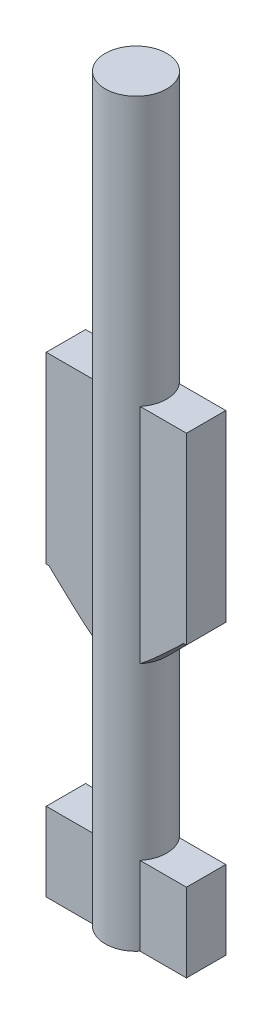
ISO-10303-21;
HEADER;
FILE_DESCRIPTION(('STEP AP214'),'2;1');
FILE_NAME('part.step','',(''),(''),'','','');
FILE_SCHEMA(('AUTOMOTIVE_DESIGN { 1 0 10303 214 1 1 1 1 }'));
ENDSEC;
DATA;
#1=APPLICATION_CONTEXT('core data for automotive mechanical design processes');
#2=APPLICATION_PROTOCOL_DEFINITION('international standard','automotive_design',2000,#1);
#3=PRODUCT_CONTEXT('',#1,'mechanical');
#4=PRODUCT('Part','Part','',(#3));
#5=PRODUCT_RELATED_PRODUCT_CATEGORY('part','',(#4));
#6=PRODUCT_DEFINITION_FORMATION('','',#4);
#7=PRODUCT_DEFINITION_CONTEXT('part definition',#1,'design');
#8=PRODUCT_DEFINITION('design','',#6,#7);
#9=PRODUCT_DEFINITION_SHAPE('','',#8);
#10=(LENGTH_UNIT() NAMED_UNIT(*) SI_UNIT(.MILLI.,.METRE.));
#11=(NAMED_UNIT(*) PLANE_ANGLE_UNIT() SI_UNIT($,.RADIAN.));
#12=(NAMED_UNIT(*) SI_UNIT($,.STERADIAN.) SOLID_ANGLE_UNIT());
#13=UNCERTAINTY_MEASURE_WITH_UNIT(LENGTH_MEASURE(1.E-05),#10,'distance_accuracy_value','');
#14=(GEOMETRIC_REPRESENTATION_CONTEXT(3) GLOBAL_UNCERTAINTY_ASSIGNED_CONTEXT((#13)) GLOBAL_UNIT_ASSIGNED_CONTEXT((#10,
#11,#12)) REPRESENTATION_CONTEXT('',''));
#15=CARTESIAN_POINT('',(0.,0.,0.));
#16=DIRECTION('',(0.,0.,1.));
#17=DIRECTION('',(1.,0.,0.));
#18=AXIS2_PLACEMENT_3D('',#15,#16,#17);
#19=CARTESIAN_POINT('',(0.,22.,0.));
#20=DIRECTION('',(0.,1.,0.));
#21=DIRECTION('',(0.,0.,1.));
#22=AXIS2_PLACEMENT_3D('',#19,#20,#21);
#23=PLANE('',#22);
#24=DIRECTION('',(-1.,0.,0.));
#25=VECTOR('',#24,1.);
#26=CARTESIAN_POINT('',(0.,22.,1.5));
#27=LINE('',#26,#25);
#28=CARTESIAN_POINT('',(5.35,22.,1.5));
#29=VERTEX_POINT('',#28);
#30=CARTESIAN_POINT('',(5.13541624408384,22.,1.5));
#31=VERTEX_POINT('',#30);
#32=EDGE_CURVE('E296',#29,#31,#27,.T.);
#33=ORIENTED_EDGE('',*,*,#32,.T.);
#34=CARTESIAN_POINT('',(0.,22.,0.));
#35=DIRECTION('',(0.,1.,0.));
#36=DIRECTION('',(0.,0.,1.));
#37=AXIS2_PLACEMENT_3D('',#34,#35,#36);
#38=CIRCLE('',#37,5.35000000000001);
#39=CARTESIAN_POINT('',(5.35,22.,0.));
#40=VERTEX_POINT('',#39);
#41=EDGE_CURVE('E326',#31,#40,#38,.T.);
#42=ORIENTED_EDGE('',*,*,#41,.T.);
#43=DIRECTION('',(0.,0.,1.));
#44=VECTOR('',#43,1.);
#45=CARTESIAN_POINT('',(5.35,22.,0.));
#46=LINE('',#45,#44);
#47=EDGE_CURVE('E295',#40,#29,#46,.T.);
#48=ORIENTED_EDGE('',*,*,#47,.T.);
#49=EDGE_LOOP('',(#33,#42,#48));
#50=FACE_BOUND('',#49,.T.);
#51=ADVANCED_FACE('F47',(#50),#23,.F.);
#52=DIRECTION('',(-1.,0.,0.));
#53=VECTOR('',#52,1.);
#54=CARTESIAN_POINT('',(0.,22.,-1.5));
#55=LINE('',#54,#53);
#56=CARTESIAN_POINT('',(-5.13541624408384,22.,-1.5));
#57=VERTEX_POINT('',#56);
#58=CARTESIAN_POINT('',(-5.35,22.,-1.5));
#59=VERTEX_POINT('',#58);
#60=EDGE_CURVE('E286',#57,#59,#55,.T.);
#61=ORIENTED_EDGE('',*,*,#60,.F.);
#62=CARTESIAN_POINT('',(0.,22.,0.));
#63=DIRECTION('',(0.,1.,0.));
#64=DIRECTION('',(0.,0.,1.));
#65=AXIS2_PLACEMENT_3D('',#62,#63,#64);
#66=CIRCLE('',#65,5.35000000000001);
#67=CARTESIAN_POINT('',(-5.35,22.,0.));
#68=VERTEX_POINT('',#67);
#69=EDGE_CURVE('E232',#57,#68,#66,.T.);
#70=ORIENTED_EDGE('',*,*,#69,.T.);
#71=DIRECTION('',(0.,0.,1.));
#72=VECTOR('',#71,1.);
#73=CARTESIAN_POINT('',(-5.35,22.,0.));
#74=LINE('',#73,#72);
#75=EDGE_CURVE('E281',#59,#68,#74,.T.);
#76=ORIENTED_EDGE('',*,*,#75,.F.);
#77=EDGE_LOOP('',(#61,#70,#76));
#78=FACE_BOUND('',#77,.T.);
#79=ADVANCED_FACE('F402',(#78),#23,.F.);
#80=CARTESIAN_POINT('',(0.,36.,0.));
#81=DIRECTION('',(0.,1.,0.));
#82=DIRECTION('',(0.,0.,1.));
#83=AXIS2_PLACEMENT_3D('',#80,#81,#82);
#84=PLANE('',#83);
#85=CARTESIAN_POINT('',(0.,36.,0.));
#86=DIRECTION('',(0.,1.,0.));
#87=DIRECTION('',(0.,0.,1.));
#88=AXIS2_PLACEMENT_3D('',#85,#86,#87);
#89=CIRCLE('',#88,2.35);
#90=CARTESIAN_POINT('',(1.80900525151256,36.,1.5));
#91=VERTEX_POINT('',#90);
#92=CARTESIAN_POINT('',(1.80900525151255,36.,-1.5));
#93=VERTEX_POINT('',#92);
#94=EDGE_CURVE('E204',#91,#93,#89,.T.);
#95=ORIENTED_EDGE('',*,*,#94,.F.);
#96=DIRECTION('',(-1.,0.,0.));
#97=VECTOR('',#96,1.);
#98=CARTESIAN_POINT('',(0.,36.,1.5));
#99=LINE('',#98,#97);
#100=CARTESIAN_POINT('',(5.35,36.,1.5));
#101=VERTEX_POINT('',#100);
#102=EDGE_CURVE('E184',#101,#91,#99,.T.);
#103=ORIENTED_EDGE('',*,*,#102,.F.);
#104=DIRECTION('',(0.,0.,1.));
#105=VECTOR('',#104,1.);
#106=CARTESIAN_POINT('',(5.35,36.,0.));
#107=LINE('',#106,#105);
#108=CARTESIAN_POINT('',(5.35,36.,-1.5));
#109=VERTEX_POINT('',#108);
#110=EDGE_CURVE('E197',#109,#101,#107,.T.);
#111=ORIENTED_EDGE('',*,*,#110,.F.);
#112=DIRECTION('',(1.,0.,0.));
#113=VECTOR('',#112,1.);
#114=CARTESIAN_POINT('',(0.,36.,-1.5));
#115=LINE('',#114,#113);
#116=EDGE_CURVE('E214',#93,#109,#115,.T.);
#117=ORIENTED_EDGE('',*,*,#116,.F.);
#118=EDGE_LOOP('',(#95,#103,#111,#117));
#119=FACE_BOUND('',#118,.T.);
#120=ADVANCED_FACE('F212',(#119),#84,.T.);
#121=CARTESIAN_POINT('',(0.,6.,0.));
#122=DIRECTION('',(0.,1.,0.));
#123=DIRECTION('',(0.,0.,1.));
#124=AXIS2_PLACEMENT_3D('',#121,#122,#123);
#125=PLANE('',#124);
#126=CARTESIAN_POINT('',(0.,6.,0.));
#127=DIRECTION('',(0.,1.,0.));
#128=DIRECTION('',(0.,0.,1.));
#129=AXIS2_PLACEMENT_3D('',#126,#127,#128);
#130=CIRCLE('',#129,2.35);
#131=CARTESIAN_POINT('',(1.80900525151256,6.,1.5));
#132=VERTEX_POINT('',#131);
#133=CARTESIAN_POINT('',(1.80900525151255,6.,-1.5));
#134=VERTEX_POINT('',#133);
#135=EDGE_CURVE('E237',#132,#134,#130,.T.);
#136=ORIENTED_EDGE('',*,*,#135,.F.);
#137=DIRECTION('',(1.,0.,0.));
#138=VECTOR('',#137,1.);
#139=CARTESIAN_POINT('',(0.,6.,1.5));
#140=LINE('',#139,#138);
#141=CARTESIAN_POINT('',(5.35,6.,1.5));
#142=VERTEX_POINT('',#141);
#143=EDGE_CURVE('E490',#132,#142,#140,.T.);
#144=ORIENTED_EDGE('',*,*,#143,.T.);
#145=DIRECTION('',(0.,0.,-1.));
#146=VECTOR('',#145,1.);
#147=CARTESIAN_POINT('',(5.35,6.,0.));
#148=LINE('',#147,#146);
#149=CARTESIAN_POINT('',(5.35,6.,-1.5));
#150=VERTEX_POINT('',#149);
#151=EDGE_CURVE('E487',#142,#150,#148,.T.);
#152=ORIENTED_EDGE('',*,*,#151,.T.);
#153=DIRECTION('',(-1.,0.,0.));
#154=VECTOR('',#153,1.);
#155=CARTESIAN_POINT('',(0.,6.,-1.5));
#156=LINE('',#155,#154);
#157=EDGE_CURVE('E484',#150,#134,#156,.T.);
#158=ORIENTED_EDGE('',*,*,#157,.T.);
#159=EDGE_LOOP('',(#136,#144,#152,#158));
#160=FACE_BOUND('',#159,.T.);
#161=ADVANCED_FACE('F366',(#160),#125,.T.);
#162=CARTESIAN_POINT('',(0.,6.,1.5));
#163=DIRECTION('',(0.,0.,1.));
#164=DIRECTION('',(1.,0.,0.));
#165=AXIS2_PLACEMENT_3D('',#162,#163,#164);
#166=PLANE('',#165);
#167=DIRECTION('',(-1.,0.,0.));
#168=VECTOR('',#167,1.);
#169=CARTESIAN_POINT('',(0.,0.,1.5));
#170=LINE('',#169,#168);
#171=CARTESIAN_POINT('',(-1.80900525151255,0.,1.5));
#172=VERTEX_POINT('',#171);
#173=CARTESIAN_POINT('',(-5.35,0.,1.5));
#174=VERTEX_POINT('',#173);
#175=EDGE_CURVE('E247',#172,#174,#170,.T.);
#176=ORIENTED_EDGE('',*,*,#175,.F.);
#177=DIRECTION('',(0.,-1.,0.));
#178=VECTOR('',#177,1.);
#179=CARTESIAN_POINT('',(-1.80900525151255,6.,1.5));
#180=LINE('',#179,#178);
#181=CARTESIAN_POINT('',(-1.80900525151255,6.,1.5));
#182=VERTEX_POINT('',#181);
#183=EDGE_CURVE('E235',#182,#172,#180,.T.);
#184=ORIENTED_EDGE('',*,*,#183,.F.);
#185=DIRECTION('',(-1.,0.,0.));
#186=VECTOR('',#185,1.);
#187=CARTESIAN_POINT('',(0.,6.,1.5));
#188=LINE('',#187,#186);
#189=CARTESIAN_POINT('',(-5.35,6.,1.5));
#190=VERTEX_POINT('',#189);
#191=EDGE_CURVE('E460',#182,#190,#188,.T.);
#192=ORIENTED_EDGE('',*,*,#191,.T.);
#193=DIRECTION('',(0.,-1.,0.));
#194=VECTOR('',#193,1.);
#195=CARTESIAN_POINT('',(-5.35,6.,1.5));
#196=LINE('',#195,#194);
#197=EDGE_CURVE('E452',#190,#174,#196,.T.);
#198=ORIENTED_EDGE('',*,*,#197,.T.);
#199=EDGE_LOOP('',(#176,#184,#192,#198));
#200=FACE_BOUND('',#199,.T.);
#201=ADVANCED_FACE('F361',(#200),#166,.T.);
#202=CARTESIAN_POINT('',(0.,6.,1.5));
#203=DIRECTION('',(0.,0.,-1.));
#204=DIRECTION('',(-1.,0.,0.));
#205=AXIS2_PLACEMENT_3D('',#202,#203,#204);
#206=PLANE('',#205);
#207=DIRECTION('',(1.,0.,0.));
#208=VECTOR('',#207,1.);
#209=CARTESIAN_POINT('',(0.,0.,1.5));
#210=LINE('',#209,#208);
#211=CARTESIAN_POINT('',(1.80900525151256,0.,1.5));
#212=VERTEX_POINT('',#211);
#213=CARTESIAN_POINT('',(5.35,0.,1.5));
#214=VERTEX_POINT('',#213);
#215=EDGE_CURVE('E472',#212,#214,#210,.T.);
#216=ORIENTED_EDGE('',*,*,#215,.T.);
#217=DIRECTION('',(0.,-1.,0.));
#218=VECTOR('',#217,1.);
#219=CARTESIAN_POINT('',(5.35,6.,1.5));
#220=LINE('',#219,#218);
#221=EDGE_CURVE('E435',#142,#214,#220,.T.);
#222=ORIENTED_EDGE('',*,*,#221,.F.);
#223=ORIENTED_EDGE('',*,*,#143,.F.);
#224=DIRECTION('',(0.,-1.,0.));
#225=VECTOR('',#224,1.);
#226=CARTESIAN_POINT('',(1.80900525151256,6.,1.5));
#227=LINE('',#226,#225);
#228=EDGE_CURVE('E241',#132,#212,#227,.T.);
#229=ORIENTED_EDGE('',*,*,#228,.T.);
#230=EDGE_LOOP('',(#216,#222,#223,#229));
#231=FACE_BOUND('',#230,.T.);
#232=ADVANCED_FACE('F365',(#231),#206,.F.);
#233=CARTESIAN_POINT('',(5.35,6.,0.));
#234=DIRECTION('',(-1.,0.,0.));
#235=DIRECTION('',(0.,0.,1.));
#236=AXIS2_PLACEMENT_3D('',#233,#234,#235);
#237=PLANE('',#236);
#238=DIRECTION('',(0.,0.,-1.));
#239=VECTOR('',#238,1.);
#240=CARTESIAN_POINT('',(5.35,0.,0.));
#241=LINE('',#240,#239);
#242=CARTESIAN_POINT('',(5.35,0.,-1.5));
#243=VERTEX_POINT('',#242);
#244=EDGE_CURVE('E469',#214,#243,#241,.T.);
#245=ORIENTED_EDGE('',*,*,#244,.T.);
#246=DIRECTION('',(0.,-1.,0.));
#247=VECTOR('',#246,1.);
#248=CARTESIAN_POINT('',(5.35,6.,-1.5));
#249=LINE('',#248,#247);
#250=EDGE_CURVE('E439',#150,#243,#249,.T.);
#251=ORIENTED_EDGE('',*,*,#250,.F.);
#252=ORIENTED_EDGE('',*,*,#151,.F.);
#253=ORIENTED_EDGE('',*,*,#221,.T.);
#254=EDGE_LOOP('',(#245,#251,#252,#253));
#255=FACE_BOUND('',#254,.T.);
#256=ADVANCED_FACE('F370',(#255),#237,.F.);
#257=CARTESIAN_POINT('',(0.,6.,-1.5));
#258=DIRECTION('',(0.,0.,1.));
#259=DIRECTION('',(1.,0.,0.));
#260=AXIS2_PLACEMENT_3D('',#257,#258,#259);
#261=PLANE('',#260);
#262=DIRECTION('',(-1.,0.,0.));
#263=VECTOR('',#262,1.);
#264=CARTESIAN_POINT('',(0.,0.,-1.5));
#265=LINE('',#264,#263);
#266=CARTESIAN_POINT('',(1.80900525151255,0.,-1.5));
#267=VERTEX_POINT('',#266);
#268=EDGE_CURVE('E466',#243,#267,#265,.T.);
#269=ORIENTED_EDGE('',*,*,#268,.T.);
#270=DIRECTION('',(0.,-1.,0.));
#271=VECTOR('',#270,1.);
#272=CARTESIAN_POINT('',(1.80900525151255,6.,-1.5));
#273=LINE('',#272,#271);
#274=EDGE_CURVE('E443',#134,#267,#273,.T.);
#275=ORIENTED_EDGE('',*,*,#274,.F.);
#276=ORIENTED_EDGE('',*,*,#157,.F.);
#277=ORIENTED_EDGE('',*,*,#250,.T.);
#278=EDGE_LOOP('',(#269,#275,#276,#277));
#279=FACE_BOUND('',#278,.T.);
#280=ADVANCED_FACE('F374',(#279),#261,.F.);
#281=CARTESIAN_POINT('',(0.,6.,0.));
#282=DIRECTION('',(0.,-1.,0.));
#283=DIRECTION('',(0.,0.,-1.));
#284=AXIS2_PLACEMENT_3D('',#281,#282,#283);
#285=CYLINDRICAL_SURFACE('',#284,2.35);
#286=DIRECTION('',(0.,-1.,0.));
#287=VECTOR('',#286,1.);
#288=CARTESIAN_POINT('',(-1.80900525151255,36.,1.5));
#289=LINE('',#288,#287);
#290=CARTESIAN_POINT('',(-1.80900525151255,36.,1.5));
#291=VERTEX_POINT('',#290);
#292=CARTESIAN_POINT('',(-1.80900525151255,19.,1.5));
#293=VERTEX_POINT('',#292);
#294=EDGE_CURVE('E209',#291,#293,#289,.T.);
#295=ORIENTED_EDGE('',*,*,#294,.T.);
#296=CARTESIAN_POINT('',(0.,19.,0.));
#297=DIRECTION('',(0.,1.,0.));
#298=DIRECTION('',(0.,0.,1.));
#299=AXIS2_PLACEMENT_3D('',#296,#297,#298);
#300=CIRCLE('',#299,2.35);
#301=CARTESIAN_POINT('',(-1.80900525151255,19.,-1.5));
#302=VERTEX_POINT('',#301);
#303=EDGE_CURVE('E329',#293,#302,#300,.F.);
#304=ORIENTED_EDGE('',*,*,#303,.T.);
#305=DIRECTION('',(0.,-1.,0.));
#306=VECTOR('',#305,1.);
#307=CARTESIAN_POINT('',(-1.80900525151255,36.,-1.5));
#308=LINE('',#307,#306);
#309=CARTESIAN_POINT('',(-1.80900525151255,36.,-1.5));
#310=VERTEX_POINT('',#309);
#311=EDGE_CURVE('E269',#310,#302,#308,.T.);
#312=ORIENTED_EDGE('',*,*,#311,.F.);
#313=EDGE_CURVE('E218',#310,#291,#89,.T.);
#314=ORIENTED_EDGE('',*,*,#313,.T.);
#315=EDGE_LOOP('',(#295,#304,#312,#314));
#316=FACE_BOUND('',#315,.T.);
#317=CARTESIAN_POINT('',(0.,0.,0.));
#318=DIRECTION('',(0.,1.,0.));
#319=DIRECTION('',(0.,0.,1.));
#320=AXIS2_PLACEMENT_3D('',#317,#318,#319);
#321=CIRCLE('',#320,2.35);
#322=CARTESIAN_POINT('',(-1.80900525151255,0.,-1.5));
#323=VERTEX_POINT('',#322);
#324=EDGE_CURVE('E465',#267,#323,#321,.T.);
#325=ORIENTED_EDGE('',*,*,#324,.T.);
#326=DIRECTION('',(0.,-1.,0.));
#327=VECTOR('',#326,1.);
#328=CARTESIAN_POINT('',(-1.80900525151255,6.,-1.5));
#329=LINE('',#328,#327);
#330=CARTESIAN_POINT('',(-1.80900525151255,6.,-1.5));
#331=VERTEX_POINT('',#330);
#332=EDGE_CURVE('E446',#331,#323,#329,.T.);
#333=ORIENTED_EDGE('',*,*,#332,.F.);
#334=EDGE_CURVE('E227',#331,#182,#130,.T.);
#335=ORIENTED_EDGE('',*,*,#334,.T.);
#336=ORIENTED_EDGE('',*,*,#183,.T.);
#337=EDGE_CURVE('E254',#172,#212,#321,.T.);
#338=ORIENTED_EDGE('',*,*,#337,.T.);
#339=ORIENTED_EDGE('',*,*,#228,.F.);
#340=ORIENTED_EDGE('',*,*,#135,.T.);
#341=ORIENTED_EDGE('',*,*,#274,.T.);
#342=EDGE_LOOP('',(#325,#333,#335,#336,#338,#339,#340,#341));
#343=FACE_BOUND('',#342,.T.);
#344=DIRECTION('',(0.,-1.,0.));
#345=VECTOR('',#344,1.);
#346=CARTESIAN_POINT('',(1.80900525151255,36.,-1.5));
#347=LINE('',#346,#345);
#348=CARTESIAN_POINT('',(1.80900525151255,19.,-1.5));
#349=VERTEX_POINT('',#348);
#350=EDGE_CURVE('E266',#93,#349,#347,.T.);
#351=ORIENTED_EDGE('',*,*,#350,.T.);
#352=CARTESIAN_POINT('',(0.,19.,0.));
#353=DIRECTION('',(0.,1.,0.));
#354=DIRECTION('',(0.,0.,1.));
#355=AXIS2_PLACEMENT_3D('',#352,#353,#354);
#356=CIRCLE('',#355,2.35);
#357=CARTESIAN_POINT('',(1.80900525151256,19.,1.5));
#358=VERTEX_POINT('',#357);
#359=EDGE_CURVE('E206',#349,#358,#356,.F.);
#360=ORIENTED_EDGE('',*,*,#359,.T.);
#361=DIRECTION('',(0.,-1.,0.));
#362=VECTOR('',#361,1.);
#363=CARTESIAN_POINT('',(1.80900525151256,36.,1.5));
#364=LINE('',#363,#362);
#365=EDGE_CURVE('E188',#91,#358,#364,.T.);
#366=ORIENTED_EDGE('',*,*,#365,.F.);
#367=ORIENTED_EDGE('',*,*,#94,.T.);
#368=EDGE_LOOP('',(#351,#360,#366,#367));
#369=FACE_BOUND('',#368,.T.);
#370=CARTESIAN_POINT('',(0.,56.5,0.));
#371=DIRECTION('',(0.,1.,0.));
#372=DIRECTION('',(0.,0.,1.));
#373=AXIS2_PLACEMENT_3D('',#370,#371,#372);
#374=CIRCLE('',#373,2.35);
#375=CARTESIAN_POINT('',(0.,56.5,2.35));
#376=VERTEX_POINT('',#375);
#377=EDGE_CURVE('E216',#376,#376,#374,.T.);
#378=ORIENTED_EDGE('',*,*,#377,.F.);
#379=EDGE_LOOP('',(#378));
#380=FACE_BOUND('',#379,.T.);
#381=ADVANCED_FACE('F202',(#316,#343,#369,#380),#285,.T.);
#382=CARTESIAN_POINT('',(0.,6.,-1.5));
#383=DIRECTION('',(0.,0.,-1.));
#384=DIRECTION('',(-1.,0.,0.));
#385=AXIS2_PLACEMENT_3D('',#382,#383,#384);
#386=PLANE('',#385);
#387=DIRECTION('',(1.,0.,0.));
#388=VECTOR('',#387,1.);
#389=CARTESIAN_POINT('',(0.,0.,-1.5));
#390=LINE('',#389,#388);
#391=CARTESIAN_POINT('',(-5.35,0.,-1.5));
#392=VERTEX_POINT('',#391);
#393=EDGE_CURVE('E461',#392,#323,#390,.T.);
#394=ORIENTED_EDGE('',*,*,#393,.F.);
#395=DIRECTION('',(0.,-1.,0.));
#396=VECTOR('',#395,1.);
#397=CARTESIAN_POINT('',(-5.35,6.,-1.5));
#398=LINE('',#397,#396);
#399=CARTESIAN_POINT('',(-5.35,6.,-1.5));
#400=VERTEX_POINT('',#399);
#401=EDGE_CURVE('E449',#400,#392,#398,.T.);
#402=ORIENTED_EDGE('',*,*,#401,.F.);
#403=DIRECTION('',(1.,0.,0.));
#404=VECTOR('',#403,1.);
#405=CARTESIAN_POINT('',(0.,6.,-1.5));
#406=LINE('',#405,#404);
#407=EDGE_CURVE('E480',#400,#331,#406,.T.);
#408=ORIENTED_EDGE('',*,*,#407,.T.);
#409=ORIENTED_EDGE('',*,*,#332,.T.);
#410=EDGE_LOOP('',(#394,#402,#408,#409));
#411=FACE_BOUND('',#410,.T.);
#412=ADVANCED_FACE('F381',(#411),#386,.T.);
#413=CARTESIAN_POINT('',(-5.35,6.,0.));
#414=DIRECTION('',(-1.,0.,0.));
#415=DIRECTION('',(0.,0.,1.));
#416=AXIS2_PLACEMENT_3D('',#413,#414,#415);
#417=PLANE('',#416);
#418=DIRECTION('',(0.,0.,-1.));
#419=VECTOR('',#418,1.);
#420=CARTESIAN_POINT('',(-5.35,0.,0.));
#421=LINE('',#420,#419);
#422=EDGE_CURVE('E456',#174,#392,#421,.T.);
#423=ORIENTED_EDGE('',*,*,#422,.F.);
#424=ORIENTED_EDGE('',*,*,#197,.F.);
#425=DIRECTION('',(0.,0.,-1.));
#426=VECTOR('',#425,1.);
#427=CARTESIAN_POINT('',(-5.35,6.,0.));
#428=LINE('',#427,#426);
#429=EDGE_CURVE('E455',#190,#400,#428,.T.);
#430=ORIENTED_EDGE('',*,*,#429,.T.);
#431=ORIENTED_EDGE('',*,*,#401,.T.);
#432=EDGE_LOOP('',(#423,#424,#430,#431));
#433=FACE_BOUND('',#432,.T.);
#434=ADVANCED_FACE('F384',(#433),#417,.T.);
#435=ORIENTED_EDGE('',*,*,#334,.F.);
#436=ORIENTED_EDGE('',*,*,#407,.F.);
#437=ORIENTED_EDGE('',*,*,#429,.F.);
#438=ORIENTED_EDGE('',*,*,#191,.F.);
#439=EDGE_LOOP('',(#435,#436,#437,#438));
#440=FACE_BOUND('',#439,.T.);
#441=ADVANCED_FACE('F388',(#440),#125,.T.);
#442=CARTESIAN_POINT('',(0.,0.,0.));
#443=DIRECTION('',(0.,1.,0.));
#444=DIRECTION('',(0.,0.,1.));
#445=AXIS2_PLACEMENT_3D('',#442,#443,#444);
#446=PLANE('',#445);
#447=ORIENTED_EDGE('',*,*,#175,.T.);
#448=ORIENTED_EDGE('',*,*,#422,.T.);
#449=ORIENTED_EDGE('',*,*,#393,.T.);
#450=ORIENTED_EDGE('',*,*,#324,.F.);
#451=ORIENTED_EDGE('',*,*,#268,.F.);
#452=ORIENTED_EDGE('',*,*,#244,.F.);
#453=ORIENTED_EDGE('',*,*,#215,.F.);
#454=ORIENTED_EDGE('',*,*,#337,.F.);
#455=EDGE_LOOP('',(#447,#448,#449,#450,#451,#452,#453,#454));
#456=FACE_BOUND('',#455,.T.);
#457=ADVANCED_FACE('F390',(#456),#446,.F.);
#458=CARTESIAN_POINT('',(5.35,22.,-1.5));
#459=VERTEX_POINT('',#458);
#460=EDGE_CURVE('E292',#459,#40,#46,.T.);
#461=ORIENTED_EDGE('',*,*,#460,.T.);
#462=CARTESIAN_POINT('',(0.,22.,0.));
#463=DIRECTION('',(0.,1.,0.));
#464=DIRECTION('',(0.,0.,1.));
#465=AXIS2_PLACEMENT_3D('',#462,#463,#464);
#466=CIRCLE('',#465,5.35000000000001);
#467=CARTESIAN_POINT('',(5.13541624408384,22.,-1.5));
#468=VERTEX_POINT('',#467);
#469=EDGE_CURVE('E70',#40,#468,#466,.T.);
#470=ORIENTED_EDGE('',*,*,#469,.T.);
#471=DIRECTION('',(1.,0.,0.));
#472=VECTOR('',#471,1.);
#473=CARTESIAN_POINT('',(0.,22.,-1.5));
#474=LINE('',#473,#472);
#475=EDGE_CURVE('E289',#468,#459,#474,.T.);
#476=ORIENTED_EDGE('',*,*,#475,.T.);
#477=EDGE_LOOP('',(#461,#470,#476));
#478=FACE_BOUND('',#477,.T.);
#479=ADVANCED_FACE('F392',(#478),#23,.F.);
#480=CARTESIAN_POINT('',(-5.35,22.,1.5));
#481=VERTEX_POINT('',#480);
#482=EDGE_CURVE('E285',#68,#481,#74,.T.);
#483=ORIENTED_EDGE('',*,*,#482,.F.);
#484=CARTESIAN_POINT('',(0.,22.,0.));
#485=DIRECTION('',(0.,1.,0.));
#486=DIRECTION('',(0.,0.,1.));
#487=AXIS2_PLACEMENT_3D('',#484,#485,#486);
#488=CIRCLE('',#487,5.35000000000001);
#489=CARTESIAN_POINT('',(-5.13541624408384,22.,1.5));
#490=VERTEX_POINT('',#489);
#491=EDGE_CURVE('E226',#68,#490,#488,.T.);
#492=ORIENTED_EDGE('',*,*,#491,.T.);
#493=DIRECTION('',(1.,0.,0.));
#494=VECTOR('',#493,1.);
#495=CARTESIAN_POINT('',(0.,22.,1.5));
#496=LINE('',#495,#494);
#497=EDGE_CURVE('E221',#481,#490,#496,.T.);
#498=ORIENTED_EDGE('',*,*,#497,.F.);
#499=EDGE_LOOP('',(#483,#492,#498));
#500=FACE_BOUND('',#499,.T.);
#501=ADVANCED_FACE('F410',(#500),#23,.F.);
#502=CARTESIAN_POINT('',(0.,36.,1.5));
#503=DIRECTION('',(0.,0.,-1.));
#504=DIRECTION('',(-1.,0.,0.));
#505=AXIS2_PLACEMENT_3D('',#502,#503,#504);
#506=PLANE('',#505);
#507=ORIENTED_EDGE('',*,*,#497,.T.);
#508=CARTESIAN_POINT('',(-5.13541624408384,22.,1.5));
#509=CARTESIAN_POINT('',(-5.00071843946688,21.870719233611,1.5));
#510=CARTESIAN_POINT('',(-4.86583401406333,21.7416317393575,1.5));
#511=CARTESIAN_POINT('',(-4.59555739072458,21.4839880052095,1.5));
#512=CARTESIAN_POINT('',(-4.46016518978537,21.3554317684676,1.5));
#513=CARTESIAN_POINT('',(-4.18881142526179,21.099064202338,1.5));
#514=CARTESIAN_POINT('',(-4.05285019842758,20.9712525168641,1.5));
#515=CARTESIAN_POINT('',(-3.78008007891828,20.716524109187,1.5));
#516=CARTESIAN_POINT('',(-3.64327115111969,20.5896074245394,1.5));
#517=CARTESIAN_POINT('',(-3.36843946566052,20.3369308314462,1.5));
#518=CARTESIAN_POINT('',(-3.23041604217318,20.2111716463162,1.5));
#519=CARTESIAN_POINT('',(-2.95281173159276,19.9614047027875,1.5));
#520=CARTESIAN_POINT('',(-2.81323100545015,19.8373967663408,1.5));
#521=CARTESIAN_POINT('',(-2.60211424091342,19.6533021789946,1.5));
#522=CARTESIAN_POINT('',(-2.53143007558843,19.5922392608189,1.5));
#523=CARTESIAN_POINT('',(-2.38936229644239,19.4709367357861,1.5));
#524=CARTESIAN_POINT('',(-2.31797870784265,19.4106970994276,1.5));
#525=CARTESIAN_POINT('',(-2.17432594452256,19.2912285831646,1.5));
#526=CARTESIAN_POINT('',(-2.1020564752589,19.2320000560124,1.5));
#527=CARTESIAN_POINT('',(-1.95641434860567,19.1148985392441,1.5));
#528=CARTESIAN_POINT('',(-1.88304155521169,19.0570257190298,1.5));
#529=CARTESIAN_POINT('',(-1.80900525151256,19.,1.5));
#530=B_SPLINE_CURVE_WITH_KNOTS('',3,(#508,#509,#510,#511,#512,#513,#514,#515,#516,#517,#518,
#519,#520,#521,#522,#523,#524,#525,#526,#527,#528,#529),.UNSPECIFIED.,.F.,.F.,(4,2,2,2,2,2,2,2,
2,2,4),(0.,0.560102037349028,1.12020739350906,1.68001828719652,2.23985253321364,
2.80001564047741,3.36012138036073,3.64033849074674,3.92054553337736,4.20084841423888,
4.48118613538615),.UNSPECIFIED.);
#531=EDGE_CURVE('E320',#490,#293,#530,.T.);
#532=ORIENTED_EDGE('',*,*,#531,.T.);
#533=ORIENTED_EDGE('',*,*,#294,.F.);
#534=DIRECTION('',(1.,0.,0.));
#535=VECTOR('',#534,1.);
#536=CARTESIAN_POINT('',(0.,36.,1.5));
#537=LINE('',#536,#535);
#538=CARTESIAN_POINT('',(-5.35,36.,1.5));
#539=VERTEX_POINT('',#538);
#540=EDGE_CURVE('E198',#539,#291,#537,.T.);
#541=ORIENTED_EDGE('',*,*,#540,.F.);
#542=DIRECTION('',(0.,-1.,0.));
#543=VECTOR('',#542,1.);
#544=CARTESIAN_POINT('',(-5.35,36.,1.5));
#545=LINE('',#544,#543);
#546=EDGE_CURVE('E276',#539,#481,#545,.T.);
#547=ORIENTED_EDGE('',*,*,#546,.T.);
#548=EDGE_LOOP('',(#507,#532,#533,#541,#547));
#549=FACE_BOUND('',#548,.T.);
#550=ADVANCED_FACE('F318',(#549),#506,.F.);
#551=CARTESIAN_POINT('',(0.,36.,1.5));
#552=DIRECTION('',(0.,0.,1.));
#553=DIRECTION('',(1.,0.,0.));
#554=AXIS2_PLACEMENT_3D('',#551,#552,#553);
#555=PLANE('',#554);
#556=ORIENTED_EDGE('',*,*,#32,.F.);
#557=DIRECTION('',(0.,-1.,0.));
#558=VECTOR('',#557,1.);
#559=CARTESIAN_POINT('',(5.35,36.,1.5));
#560=LINE('',#559,#558);
#561=EDGE_CURVE('E191',#101,#29,#560,.T.);
#562=ORIENTED_EDGE('',*,*,#561,.F.);
#563=ORIENTED_EDGE('',*,*,#102,.T.);
#564=ORIENTED_EDGE('',*,*,#365,.T.);
#565=CARTESIAN_POINT('',(1.80900525151255,19.,1.5));
#566=CARTESIAN_POINT('',(1.85459308370229,19.0350976945392,1.5));
#567=CARTESIAN_POINT('',(1.89992292185459,19.0705274635781,1.5));
#568=CARTESIAN_POINT('',(1.99012847959698,19.1419566235284,1.5));
#569=CARTESIAN_POINT('',(2.03500421992746,19.1779559882298,1.5));
#570=CARTESIAN_POINT('',(2.16903355285177,19.2866587895034,1.5));
#571=CARTESIAN_POINT('',(2.25760530317744,19.3600793871521,1.5));
#572=CARTESIAN_POINT('',(2.43352818275431,19.5082896180819,1.5));
#573=CARTESIAN_POINT('',(2.52087980023982,19.583078674393,1.5));
#574=CARTESIAN_POINT('',(2.69466482323332,19.7337232765897,1.5));
#575=CARTESIAN_POINT('',(2.78109818106429,19.8095788773811,1.5));
#576=CARTESIAN_POINT('',(3.03920923956875,20.0382712772868,1.5));
#577=CARTESIAN_POINT('',(3.20980645423628,20.1923262311489,1.5));
#578=CARTESIAN_POINT('',(3.54914315621955,20.5024962716011,1.5));
#579=CARTESIAN_POINT('',(3.71788243226038,20.6586115881362,1.5));
#580=CARTESIAN_POINT('',(3.9908676116239,20.9132862977556,1.5));
#581=CARTESIAN_POINT('',(4.09551149639256,21.0114197460124,1.5));
#582=CARTESIAN_POINT('',(4.30438143497065,21.208120671363,1.5));
#583=CARTESIAN_POINT('',(4.40860750756998,21.3066881285106,1.5));
#584=CARTESIAN_POINT('',(4.61675551239116,21.5042097071828,1.5));
#585=CARTESIAN_POINT('',(4.72067733714816,21.6031639418813,1.5));
#586=CARTESIAN_POINT('',(4.9282428215298,21.8013726743622,1.5));
#587=CARTESIAN_POINT('',(5.03188646903374,21.9006271848397,1.5));
#588=CARTESIAN_POINT('',(5.13541624408384,22.,1.5));
#589=B_SPLINE_CURVE_WITH_KNOTS('',3,(#565,#566,#567,#568,#569,#570,#571,#572,#573,#574,#575,
#576,#577,#578,#579,#580,#581,#582,#583,#584,#585,#586,#587,#588),.UNSPECIFIED.,.F.,.F.,(4,2,2,
2,2,2,2,2,2,2,2,4),(0.,0.172596031266816,0.345184143506358,0.690299447420002,1.03527245167357,
1.38026328060507,2.06981710981822,2.75944855800836,3.18982453543083,3.62018093577321,
4.05067443158924,4.48118638979428),.UNSPECIFIED.);
#590=EDGE_CURVE('E11',#358,#31,#589,.T.);
#591=ORIENTED_EDGE('',*,*,#590,.T.);
#592=EDGE_LOOP('',(#556,#562,#563,#564,#591));
#593=FACE_BOUND('',#592,.T.);
#594=ADVANCED_FACE('F187',(#593),#555,.T.);
#595=CARTESIAN_POINT('',(5.35,36.,0.));
#596=DIRECTION('',(1.,0.,0.));
#597=DIRECTION('',(0.,0.,-1.));
#598=AXIS2_PLACEMENT_3D('',#595,#596,#597);
#599=PLANE('',#598);
#600=ORIENTED_EDGE('',*,*,#460,.F.);
#601=DIRECTION('',(0.,-1.,0.));
#602=VECTOR('',#601,1.);
#603=CARTESIAN_POINT('',(5.35,36.,-1.5));
#604=LINE('',#603,#602);
#605=EDGE_CURVE('E262',#109,#459,#604,.T.);
#606=ORIENTED_EDGE('',*,*,#605,.F.);
#607=ORIENTED_EDGE('',*,*,#110,.T.);
#608=ORIENTED_EDGE('',*,*,#561,.T.);
#609=ORIENTED_EDGE('',*,*,#47,.F.);
#610=EDGE_LOOP('',(#600,#606,#607,#608,#609));
#611=FACE_BOUND('',#610,.T.);
#612=ADVANCED_FACE('F421',(#611),#599,.T.);
#613=CARTESIAN_POINT('',(0.,36.,-1.5));
#614=DIRECTION('',(0.,0.,-1.));
#615=DIRECTION('',(-1.,0.,0.));
#616=AXIS2_PLACEMENT_3D('',#613,#614,#615);
#617=PLANE('',#616);
#618=ORIENTED_EDGE('',*,*,#475,.F.);
#619=CARTESIAN_POINT('',(5.13541624408384,22.,-1.5));
#620=CARTESIAN_POINT('',(5.00071843946688,21.870719233611,-1.5));
#621=CARTESIAN_POINT('',(4.86583401406333,21.7416317393575,-1.5));
#622=CARTESIAN_POINT('',(4.59555739072458,21.4839880052095,-1.5));
#623=CARTESIAN_POINT('',(4.46016518978537,21.3554317684676,-1.5));
#624=CARTESIAN_POINT('',(4.18881142526179,21.099064202338,-1.5));
#625=CARTESIAN_POINT('',(4.05285019842758,20.9712525168641,-1.5));
#626=CARTESIAN_POINT('',(3.78008007891828,20.716524109187,-1.5));
#627=CARTESIAN_POINT('',(3.64327115111969,20.5896074245394,-1.5));
#628=CARTESIAN_POINT('',(3.36843946566052,20.3369308314462,-1.5));
#629=CARTESIAN_POINT('',(3.23041604217318,20.2111716463162,-1.5));
#630=CARTESIAN_POINT('',(2.95281173159276,19.9614047027875,-1.5));
#631=CARTESIAN_POINT('',(2.81323100545015,19.8373967663408,-1.5));
#632=CARTESIAN_POINT('',(2.60211424091342,19.6533021789946,-1.5));
#633=CARTESIAN_POINT('',(2.53143007558843,19.5922392608189,-1.5));
#634=CARTESIAN_POINT('',(2.38936229644239,19.4709367357861,-1.5));
#635=CARTESIAN_POINT('',(2.31797870784265,19.4106970994276,-1.5));
#636=CARTESIAN_POINT('',(2.17432594452256,19.2912285831646,-1.5));
#637=CARTESIAN_POINT('',(2.1020564752589,19.2320000560124,-1.5));
#638=CARTESIAN_POINT('',(1.95641434860567,19.1148985392441,-1.5));
#639=CARTESIAN_POINT('',(1.88304155521169,19.0570257190298,-1.5));
#640=CARTESIAN_POINT('',(1.80900525151256,19.,-1.5));
#641=B_SPLINE_CURVE_WITH_KNOTS('',3,(#619,#620,#621,#622,#623,#624,#625,#626,#627,#628,#629,
#630,#631,#632,#633,#634,#635,#636,#637,#638,#639,#640),.UNSPECIFIED.,.F.,.F.,(4,2,2,2,2,2,2,2,
2,2,4),(0.,0.560102037349028,1.12020739350906,1.68001828719652,2.23985253321364,
2.80001564047741,3.36012138036073,3.64033849074674,3.92054553337736,4.20084841423888,
4.48118613538615),.UNSPECIFIED.);
#642=EDGE_CURVE('E63',#468,#349,#641,.T.);
#643=ORIENTED_EDGE('',*,*,#642,.T.);
#644=ORIENTED_EDGE('',*,*,#350,.F.);
#645=ORIENTED_EDGE('',*,*,#116,.T.);
#646=ORIENTED_EDGE('',*,*,#605,.T.);
#647=EDGE_LOOP('',(#618,#643,#644,#645,#646));
#648=FACE_BOUND('',#647,.T.);
#649=ADVANCED_FACE('F525',(#648),#617,.T.);
#650=CARTESIAN_POINT('',(0.,36.,-1.5));
#651=DIRECTION('',(0.,0.,1.));
#652=DIRECTION('',(1.,0.,0.));
#653=AXIS2_PLACEMENT_3D('',#650,#651,#652);
#654=PLANE('',#653);
#655=ORIENTED_EDGE('',*,*,#311,.T.);
#656=CARTESIAN_POINT('',(-1.80900525151255,19.,-1.5));
#657=CARTESIAN_POINT('',(-1.8545930837023,19.0350976945392,-1.5));
#658=CARTESIAN_POINT('',(-1.89992292185459,19.0705274635781,-1.5));
#659=CARTESIAN_POINT('',(-1.99012847959698,19.1419566235284,-1.5));
#660=CARTESIAN_POINT('',(-2.03500421992746,19.1779559882298,-1.5));
#661=CARTESIAN_POINT('',(-2.16903355285177,19.2866587895034,-1.5));
#662=CARTESIAN_POINT('',(-2.25760530317744,19.3600793871521,-1.5));
#663=CARTESIAN_POINT('',(-2.43352818275431,19.5082896180819,-1.5));
#664=CARTESIAN_POINT('',(-2.52087980023982,19.583078674393,-1.5));
#665=CARTESIAN_POINT('',(-2.69466482323332,19.7337232765897,-1.5));
#666=CARTESIAN_POINT('',(-2.78109818106429,19.8095788773811,-1.5));
#667=CARTESIAN_POINT('',(-3.03920923956876,20.0382712772868,-1.5));
#668=CARTESIAN_POINT('',(-3.20980645423628,20.1923262311489,-1.5));
#669=CARTESIAN_POINT('',(-3.54914315621955,20.5024962716011,-1.5));
#670=CARTESIAN_POINT('',(-3.71788243226038,20.6586115881362,-1.5));
#671=CARTESIAN_POINT('',(-3.99086761162391,20.9132862977556,-1.5));
#672=CARTESIAN_POINT('',(-4.09551149639256,21.0114197460124,-1.5));
#673=CARTESIAN_POINT('',(-4.30438143497065,21.208120671363,-1.5));
#674=CARTESIAN_POINT('',(-4.40860750756998,21.3066881285106,-1.5));
#675=CARTESIAN_POINT('',(-4.61675551239117,21.5042097071828,-1.5));
#676=CARTESIAN_POINT('',(-4.72067733714816,21.6031639418813,-1.5));
#677=CARTESIAN_POINT('',(-4.9282428215298,21.8013726743622,-1.5));
#678=CARTESIAN_POINT('',(-5.03188646903374,21.9006271848397,-1.5));
#679=CARTESIAN_POINT('',(-5.13541624408384,22.,-1.5));
#680=B_SPLINE_CURVE_WITH_KNOTS('',3,(#656,#657,#658,#659,#660,#661,#662,#663,#664,#665,#666,
#667,#668,#669,#670,#671,#672,#673,#674,#675,#676,#677,#678,#679),.UNSPECIFIED.,.F.,.F.,(4,2,2,
2,2,2,2,2,2,2,2,4),(0.,0.172596031266814,0.345184143506358,0.690299447420002,1.03527245167357,
1.38026328060507,2.06981710981822,2.75944855800836,3.18982453543083,3.62018093577321,
4.05067443158924,4.48118638979428),.UNSPECIFIED.);
#681=EDGE_CURVE('E325',#302,#57,#680,.T.);
#682=ORIENTED_EDGE('',*,*,#681,.T.);
#683=ORIENTED_EDGE('',*,*,#60,.T.);
#684=DIRECTION('',(0.,-1.,0.));
#685=VECTOR('',#684,1.);
#686=CARTESIAN_POINT('',(-5.35,36.,-1.5));
#687=LINE('',#686,#685);
#688=CARTESIAN_POINT('',(-5.35,36.,-1.5));
#689=VERTEX_POINT('',#688);
#690=EDGE_CURVE('E272',#689,#59,#687,.T.);
#691=ORIENTED_EDGE('',*,*,#690,.F.);
#692=DIRECTION('',(-1.,0.,0.));
#693=VECTOR('',#692,1.);
#694=CARTESIAN_POINT('',(0.,36.,-1.5));
#695=LINE('',#694,#693);
#696=EDGE_CURVE('E305',#310,#689,#695,.T.);
#697=ORIENTED_EDGE('',*,*,#696,.F.);
#698=EDGE_LOOP('',(#655,#682,#683,#691,#697));
#699=FACE_BOUND('',#698,.T.);
#700=ADVANCED_FACE('F514',(#699),#654,.F.);
#701=CARTESIAN_POINT('',(-5.35,36.,0.));
#702=DIRECTION('',(1.,0.,0.));
#703=DIRECTION('',(0.,0.,-1.));
#704=AXIS2_PLACEMENT_3D('',#701,#702,#703);
#705=PLANE('',#704);
#706=ORIENTED_EDGE('',*,*,#75,.T.);
#707=ORIENTED_EDGE('',*,*,#482,.T.);
#708=ORIENTED_EDGE('',*,*,#546,.F.);
#709=DIRECTION('',(0.,0.,1.));
#710=VECTOR('',#709,1.);
#711=CARTESIAN_POINT('',(-5.35,36.,0.));
#712=LINE('',#711,#710);
#713=EDGE_CURVE('E280',#689,#539,#712,.T.);
#714=ORIENTED_EDGE('',*,*,#713,.F.);
#715=ORIENTED_EDGE('',*,*,#690,.T.);
#716=EDGE_LOOP('',(#706,#707,#708,#714,#715));
#717=FACE_BOUND('',#716,.T.);
#718=ADVANCED_FACE('F426',(#717),#705,.F.);
#719=ORIENTED_EDGE('',*,*,#313,.F.);
#720=ORIENTED_EDGE('',*,*,#696,.T.);
#721=ORIENTED_EDGE('',*,*,#713,.T.);
#722=ORIENTED_EDGE('',*,*,#540,.T.);
#723=EDGE_LOOP('',(#719,#720,#721,#722));
#724=FACE_BOUND('',#723,.T.);
#725=ADVANCED_FACE('F314',(#724),#84,.T.);
#726=CARTESIAN_POINT('',(0.,56.5,0.));
#727=DIRECTION('',(0.,1.,0.));
#728=DIRECTION('',(0.,0.,1.));
#729=AXIS2_PLACEMENT_3D('',#726,#727,#728);
#730=PLANE('',#729);
#731=ORIENTED_EDGE('',*,*,#377,.T.);
#732=EDGE_LOOP('',(#731));
#733=FACE_BOUND('',#732,.T.);
#734=ADVANCED_FACE('F360',(#733),#730,.T.);
#735=CARTESIAN_POINT('',(0.,22.,0.));
#736=DIRECTION('',(0.,1.,0.));
#737=DIRECTION('',(0.,0.,1.));
#738=AXIS2_PLACEMENT_3D('',#735,#736,#737);
#739=CONICAL_SURFACE('',#738,5.35000000000001,0.785398163397454);
#740=ORIENTED_EDGE('',*,*,#681,.F.);
#741=ORIENTED_EDGE('',*,*,#303,.F.);
#742=ORIENTED_EDGE('',*,*,#531,.F.);
#743=ORIENTED_EDGE('',*,*,#491,.F.);
#744=ORIENTED_EDGE('',*,*,#69,.F.);
#745=EDGE_LOOP('',(#740,#741,#742,#743,#744));
#746=FACE_BOUND('',#745,.T.);
#747=ADVANCED_FACE('F330',(#746),#739,.T.);
#748=CARTESIAN_POINT('',(0.,22.,0.));
#749=DIRECTION('',(0.,1.,0.));
#750=DIRECTION('',(0.,0.,1.));
#751=AXIS2_PLACEMENT_3D('',#748,#749,#750);
#752=CONICAL_SURFACE('',#751,5.35000000000001,0.785398163397454);
#753=ORIENTED_EDGE('',*,*,#590,.F.);
#754=ORIENTED_EDGE('',*,*,#359,.F.);
#755=ORIENTED_EDGE('',*,*,#642,.F.);
#756=ORIENTED_EDGE('',*,*,#469,.F.);
#757=ORIENTED_EDGE('',*,*,#41,.F.);
#758=EDGE_LOOP('',(#753,#754,#755,#756,#757));
#759=FACE_BOUND('',#758,.T.);
#760=ADVANCED_FACE('F50',(#759),#752,.T.);
#761=CLOSED_SHELL('',(#51,#79,#120,#161,#201,#232,#256,#280,#381,#412,#434,#441,#457,#479,#501,
#550,#594,#612,#649,#700,#718,#725,#734,#747,#760));
#762=MANIFOLD_SOLID_BREP('B2',#761);
#763=ADVANCED_BREP_SHAPE_REPRESENTATION('',(#18,#762),#14);
#764=SHAPE_DEFINITION_REPRESENTATION(#9,#763);
ENDSEC;
END-ISO-10303-21;
